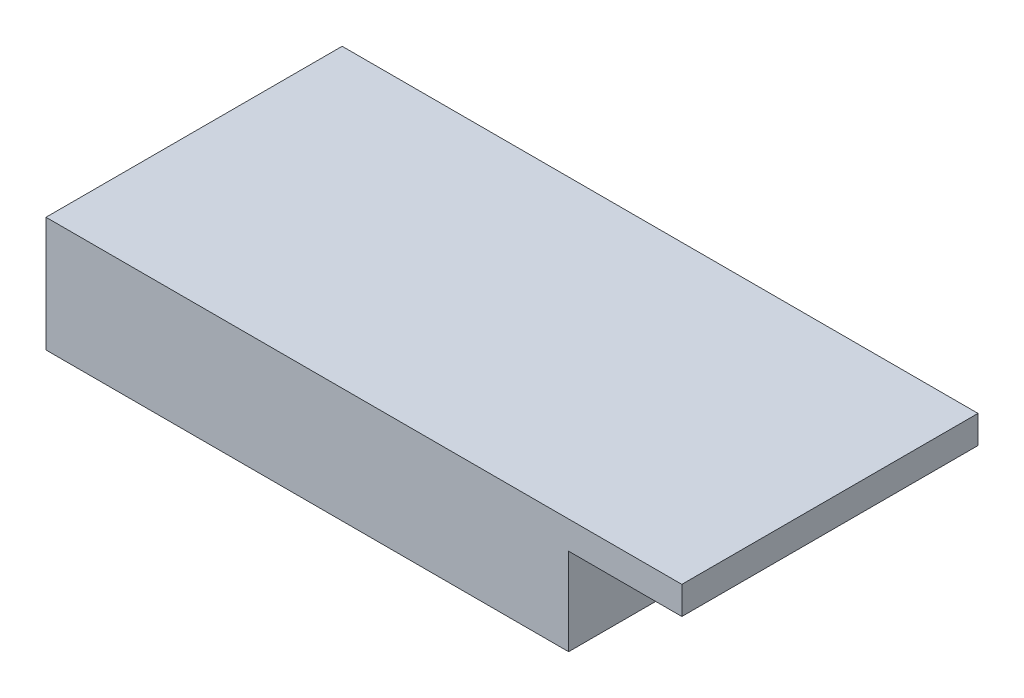
ISO-10303-21;
HEADER;
FILE_DESCRIPTION(('STEP AP214'),'2;1');
FILE_NAME('part.step','',(''),(''),'','','');
FILE_SCHEMA(('AUTOMOTIVE_DESIGN { 1 0 10303 214 1 1 1 1 }'));
ENDSEC;
DATA;
#1=APPLICATION_CONTEXT('core data for automotive mechanical design processes');
#2=APPLICATION_PROTOCOL_DEFINITION('international standard','automotive_design',2000,#1);
#3=PRODUCT_CONTEXT('',#1,'mechanical');
#4=PRODUCT('Part','Part','',(#3));
#5=PRODUCT_RELATED_PRODUCT_CATEGORY('part','',(#4));
#6=PRODUCT_DEFINITION_FORMATION('','',#4);
#7=PRODUCT_DEFINITION_CONTEXT('part definition',#1,'design');
#8=PRODUCT_DEFINITION('design','',#6,#7);
#9=PRODUCT_DEFINITION_SHAPE('','',#8);
#10=(LENGTH_UNIT() NAMED_UNIT(*) SI_UNIT(.MILLI.,.METRE.));
#11=(NAMED_UNIT(*) PLANE_ANGLE_UNIT() SI_UNIT($,.RADIAN.));
#12=(NAMED_UNIT(*) SI_UNIT($,.STERADIAN.) SOLID_ANGLE_UNIT());
#13=UNCERTAINTY_MEASURE_WITH_UNIT(LENGTH_MEASURE(1.E-05),#10,'distance_accuracy_value','');
#14=(GEOMETRIC_REPRESENTATION_CONTEXT(3) GLOBAL_UNCERTAINTY_ASSIGNED_CONTEXT((#13)) GLOBAL_UNIT_ASSIGNED_CONTEXT((#10,
#11,#12)) REPRESENTATION_CONTEXT('',''));
#15=CARTESIAN_POINT('',(0.,0.,0.));
#16=DIRECTION('',(0.,0.,1.));
#17=DIRECTION('',(1.,0.,0.));
#18=AXIS2_PLACEMENT_3D('',#15,#16,#17);
#19=CARTESIAN_POINT('',(0.,6.6,0.));
#20=DIRECTION('',(1.,0.,0.));
#21=DIRECTION('',(0.,0.,-1.));
#22=AXIS2_PLACEMENT_3D('',#19,#20,#21);
#23=PLANE('',#22);
#24=DIRECTION('',(0.,0.,1.));
#25=VECTOR('',#24,1.);
#26=CARTESIAN_POINT('',(0.,0.,0.));
#27=LINE('',#26,#25);
#28=CARTESIAN_POINT('',(0.,0.,-17.));
#29=VERTEX_POINT('',#28);
#30=CARTESIAN_POINT('',(0.,0.,0.));
#31=VERTEX_POINT('',#30);
#32=EDGE_CURVE('E101',#29,#31,#27,.T.);
#33=ORIENTED_EDGE('',*,*,#32,.T.);
#34=DIRECTION('',(0.,-1.,0.));
#35=VECTOR('',#34,1.);
#36=CARTESIAN_POINT('',(0.,6.6,0.));
#37=LINE('',#36,#35);
#38=CARTESIAN_POINT('',(0.,6.6,0.));
#39=VERTEX_POINT('',#38);
#40=EDGE_CURVE('E11',#39,#31,#37,.T.);
#41=ORIENTED_EDGE('',*,*,#40,.F.);
#42=DIRECTION('',(0.,0.,1.));
#43=VECTOR('',#42,1.);
#44=CARTESIAN_POINT('',(0.,6.6,0.));
#45=LINE('',#44,#43);
#46=CARTESIAN_POINT('',(0.,6.6,-17.));
#47=VERTEX_POINT('',#46);
#48=EDGE_CURVE('E95',#47,#39,#45,.T.);
#49=ORIENTED_EDGE('',*,*,#48,.F.);
#50=DIRECTION('',(0.,-1.,0.));
#51=VECTOR('',#50,1.);
#52=CARTESIAN_POINT('',(0.,6.6,-17.));
#53=LINE('',#52,#51);
#54=EDGE_CURVE('E85',#47,#29,#53,.T.);
#55=ORIENTED_EDGE('',*,*,#54,.T.);
#56=EDGE_LOOP('',(#33,#41,#49,#55));
#57=FACE_BOUND('',#56,.T.);
#58=ADVANCED_FACE('F39',(#57),#23,.F.);
#59=CARTESIAN_POINT('',(0.,6.6,0.));
#60=DIRECTION('',(0.,0.,-1.));
#61=DIRECTION('',(-1.,0.,0.));
#62=AXIS2_PLACEMENT_3D('',#59,#60,#61);
#63=PLANE('',#62);
#64=DIRECTION('',(1.,0.,0.));
#65=VECTOR('',#64,1.);
#66=CARTESIAN_POINT('',(0.,0.,0.));
#67=LINE('',#66,#65);
#68=CARTESIAN_POINT('',(30.,0.,0.));
#69=VERTEX_POINT('',#68);
#70=EDGE_CURVE('E106',#31,#69,#67,.T.);
#71=ORIENTED_EDGE('',*,*,#70,.T.);
#72=DIRECTION('',(0.,-1.,0.));
#73=VECTOR('',#72,1.);
#74=CARTESIAN_POINT('',(30.,6.6,0.));
#75=LINE('',#74,#73);
#76=CARTESIAN_POINT('',(30.,5.,0.));
#77=VERTEX_POINT('',#76);
#78=EDGE_CURVE('E47',#77,#69,#75,.T.);
#79=ORIENTED_EDGE('',*,*,#78,.F.);
#80=DIRECTION('',(1.,0.,0.));
#81=VECTOR('',#80,1.);
#82=CARTESIAN_POINT('',(30.,5.,0.));
#83=LINE('',#82,#81);
#84=CARTESIAN_POINT('',(36.5,5.,0.));
#85=VERTEX_POINT('',#84);
#86=EDGE_CURVE('E54',#77,#85,#83,.T.);
#87=ORIENTED_EDGE('',*,*,#86,.T.);
#88=DIRECTION('',(0.,1.,0.));
#89=VECTOR('',#88,1.);
#90=CARTESIAN_POINT('',(36.5,5.,0.));
#91=LINE('',#90,#89);
#92=CARTESIAN_POINT('',(36.5,6.6,0.));
#93=VERTEX_POINT('',#92);
#94=EDGE_CURVE('E114',#85,#93,#91,.T.);
#95=ORIENTED_EDGE('',*,*,#94,.T.);
#96=DIRECTION('',(1.,0.,0.));
#97=VECTOR('',#96,1.);
#98=CARTESIAN_POINT('',(0.,6.6,0.));
#99=LINE('',#98,#97);
#100=EDGE_CURVE('E131',#39,#93,#99,.T.);
#101=ORIENTED_EDGE('',*,*,#100,.F.);
#102=ORIENTED_EDGE('',*,*,#40,.T.);
#103=EDGE_LOOP('',(#71,#79,#87,#95,#101,#102));
#104=FACE_BOUND('',#103,.T.);
#105=ADVANCED_FACE('F128',(#104),#63,.F.);
#106=CARTESIAN_POINT('',(30.,6.6,0.));
#107=DIRECTION('',(-1.,0.,0.));
#108=DIRECTION('',(0.,0.,1.));
#109=AXIS2_PLACEMENT_3D('',#106,#107,#108);
#110=PLANE('',#109);
#111=DIRECTION('',(0.,-1.,0.));
#112=VECTOR('',#111,1.);
#113=CARTESIAN_POINT('',(30.,6.6,-17.));
#114=LINE('',#113,#112);
#115=CARTESIAN_POINT('',(30.,5.,-17.));
#116=VERTEX_POINT('',#115);
#117=CARTESIAN_POINT('',(30.,0.,-17.));
#118=VERTEX_POINT('',#117);
#119=EDGE_CURVE('E89',#116,#118,#114,.T.);
#120=ORIENTED_EDGE('',*,*,#119,.F.);
#121=DIRECTION('',(0.,0.,1.));
#122=VECTOR('',#121,1.);
#123=CARTESIAN_POINT('',(30.,5.,-17.));
#124=LINE('',#123,#122);
#125=EDGE_CURVE('E126',#116,#77,#124,.T.);
#126=ORIENTED_EDGE('',*,*,#125,.T.);
#127=ORIENTED_EDGE('',*,*,#78,.T.);
#128=DIRECTION('',(0.,0.,-1.));
#129=VECTOR('',#128,1.);
#130=CARTESIAN_POINT('',(30.,0.,0.));
#131=LINE('',#130,#129);
#132=EDGE_CURVE('E96',#69,#118,#131,.T.);
#133=ORIENTED_EDGE('',*,*,#132,.T.);
#134=EDGE_LOOP('',(#120,#126,#127,#133));
#135=FACE_BOUND('',#134,.T.);
#136=ADVANCED_FACE('F125',(#135),#110,.F.);
#137=CARTESIAN_POINT('',(0.,6.6,-17.));
#138=DIRECTION('',(0.,0.,1.));
#139=DIRECTION('',(1.,0.,0.));
#140=AXIS2_PLACEMENT_3D('',#137,#138,#139);
#141=PLANE('',#140);
#142=DIRECTION('',(-1.,0.,0.));
#143=VECTOR('',#142,1.);
#144=CARTESIAN_POINT('',(0.,0.,-17.));
#145=LINE('',#144,#143);
#146=EDGE_CURVE('E82',#118,#29,#145,.T.);
#147=ORIENTED_EDGE('',*,*,#146,.T.);
#148=ORIENTED_EDGE('',*,*,#54,.F.);
#149=DIRECTION('',(-1.,0.,0.));
#150=VECTOR('',#149,1.);
#151=CARTESIAN_POINT('',(0.,6.6,-17.));
#152=LINE('',#151,#150);
#153=CARTESIAN_POINT('',(36.5,6.6,-17.));
#154=VERTEX_POINT('',#153);
#155=EDGE_CURVE('E63',#154,#47,#152,.T.);
#156=ORIENTED_EDGE('',*,*,#155,.F.);
#157=DIRECTION('',(0.,1.,0.));
#158=VECTOR('',#157,1.);
#159=CARTESIAN_POINT('',(36.5,5.,-17.));
#160=LINE('',#159,#158);
#161=CARTESIAN_POINT('',(36.5,5.,-17.));
#162=VERTEX_POINT('',#161);
#163=EDGE_CURVE('E108',#162,#154,#160,.T.);
#164=ORIENTED_EDGE('',*,*,#163,.F.);
#165=DIRECTION('',(-1.,0.,0.));
#166=VECTOR('',#165,1.);
#167=CARTESIAN_POINT('',(30.,5.,-17.));
#168=LINE('',#167,#166);
#169=EDGE_CURVE('E141',#162,#116,#168,.T.);
#170=ORIENTED_EDGE('',*,*,#169,.T.);
#171=ORIENTED_EDGE('',*,*,#119,.T.);
#172=EDGE_LOOP('',(#147,#148,#156,#164,#170,#171));
#173=FACE_BOUND('',#172,.T.);
#174=ADVANCED_FACE('F84',(#173),#141,.F.);
#175=CARTESIAN_POINT('',(0.,6.6,0.));
#176=DIRECTION('',(0.,-1.,0.));
#177=DIRECTION('',(0.,0.,-1.));
#178=AXIS2_PLACEMENT_3D('',#175,#176,#177);
#179=PLANE('',#178);
#180=ORIENTED_EDGE('',*,*,#48,.T.);
#181=ORIENTED_EDGE('',*,*,#100,.T.);
#182=DIRECTION('',(0.,0.,-1.));
#183=VECTOR('',#182,1.);
#184=CARTESIAN_POINT('',(36.5,6.6,-17.));
#185=LINE('',#184,#183);
#186=EDGE_CURVE('E143',#93,#154,#185,.T.);
#187=ORIENTED_EDGE('',*,*,#186,.T.);
#188=ORIENTED_EDGE('',*,*,#155,.T.);
#189=EDGE_LOOP('',(#180,#181,#187,#188));
#190=FACE_BOUND('',#189,.T.);
#191=ADVANCED_FACE('F136',(#190),#179,.F.);
#192=CARTESIAN_POINT('',(0.,0.,0.));
#193=DIRECTION('',(0.,-1.,0.));
#194=DIRECTION('',(0.,0.,-1.));
#195=AXIS2_PLACEMENT_3D('',#192,#193,#194);
#196=PLANE('',#195);
#197=ORIENTED_EDGE('',*,*,#32,.F.);
#198=ORIENTED_EDGE('',*,*,#146,.F.);
#199=ORIENTED_EDGE('',*,*,#132,.F.);
#200=ORIENTED_EDGE('',*,*,#70,.F.);
#201=EDGE_LOOP('',(#197,#198,#199,#200));
#202=FACE_BOUND('',#201,.T.);
#203=ADVANCED_FACE('F104',(#202),#196,.T.);
#204=CARTESIAN_POINT('',(36.5,5.,-17.));
#205=DIRECTION('',(1.,0.,0.));
#206=DIRECTION('',(0.,0.,-1.));
#207=AXIS2_PLACEMENT_3D('',#204,#205,#206);
#208=PLANE('',#207);
#209=ORIENTED_EDGE('',*,*,#186,.F.);
#210=ORIENTED_EDGE('',*,*,#94,.F.);
#211=DIRECTION('',(0.,0.,-1.));
#212=VECTOR('',#211,1.);
#213=CARTESIAN_POINT('',(36.5,5.,-17.));
#214=LINE('',#213,#212);
#215=EDGE_CURVE('E148',#85,#162,#214,.T.);
#216=ORIENTED_EDGE('',*,*,#215,.T.);
#217=ORIENTED_EDGE('',*,*,#163,.T.);
#218=EDGE_LOOP('',(#209,#210,#216,#217));
#219=FACE_BOUND('',#218,.T.);
#220=ADVANCED_FACE('F166',(#219),#208,.T.);
#221=CARTESIAN_POINT('',(0.,5.,0.));
#222=DIRECTION('',(0.,1.,0.));
#223=DIRECTION('',(0.,0.,1.));
#224=AXIS2_PLACEMENT_3D('',#221,#222,#223);
#225=PLANE('',#224);
#226=ORIENTED_EDGE('',*,*,#125,.F.);
#227=ORIENTED_EDGE('',*,*,#169,.F.);
#228=ORIENTED_EDGE('',*,*,#215,.F.);
#229=ORIENTED_EDGE('',*,*,#86,.F.);
#230=EDGE_LOOP('',(#226,#227,#228,#229));
#231=FACE_BOUND('',#230,.T.);
#232=ADVANCED_FACE('F165',(#231),#225,.F.);
#233=CLOSED_SHELL('',(#58,#105,#136,#174,#191,#203,#220,#232));
#234=MANIFOLD_SOLID_BREP('B2',#233);
#235=ADVANCED_BREP_SHAPE_REPRESENTATION('',(#18,#234),#14);
#236=SHAPE_DEFINITION_REPRESENTATION(#9,#235);
ENDSEC;
END-ISO-10303-21;
